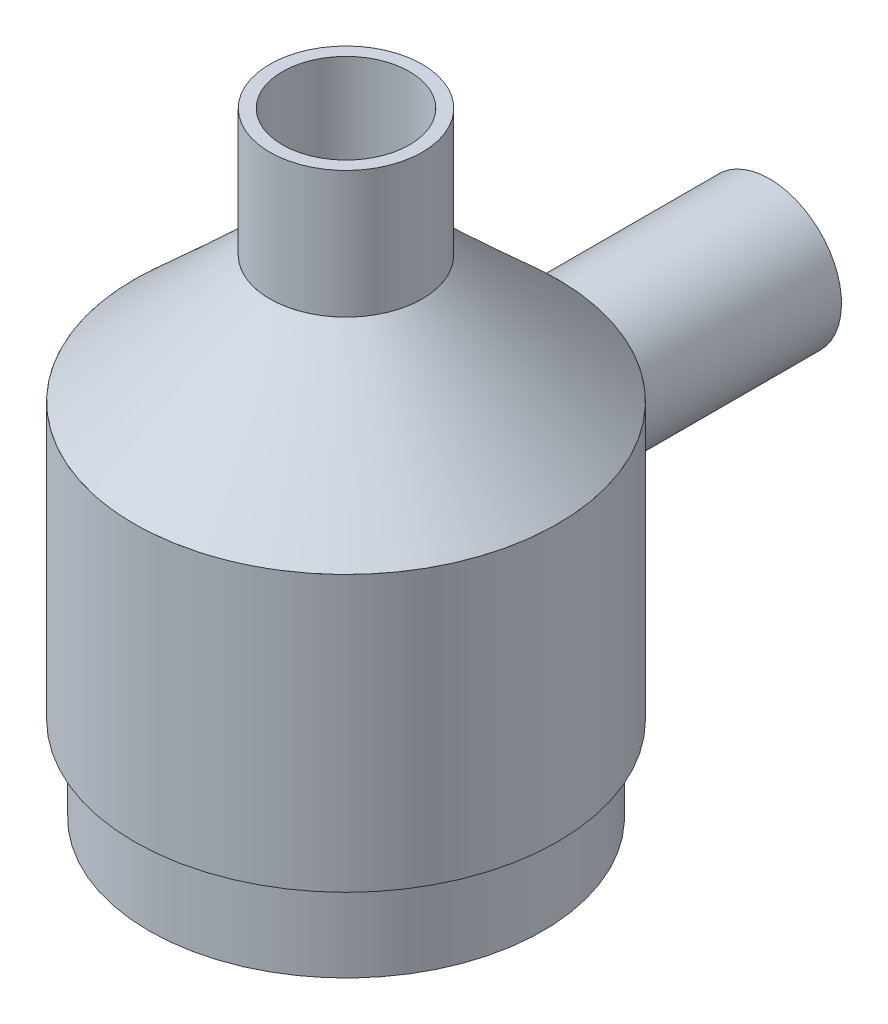
ISO-10303-21;
HEADER;
FILE_DESCRIPTION(('STEP AP214'),'2;1');
FILE_NAME('part.step','',(''),(''),'','','');
FILE_SCHEMA(('AUTOMOTIVE_DESIGN { 1 0 10303 214 1 1 1 1 }'));
ENDSEC;
DATA;
#1=APPLICATION_CONTEXT('core data for automotive mechanical design processes');
#2=APPLICATION_PROTOCOL_DEFINITION('international standard','automotive_design',2000,#1);
#3=PRODUCT_CONTEXT('',#1,'mechanical');
#4=PRODUCT('Part','Part','',(#3));
#5=PRODUCT_RELATED_PRODUCT_CATEGORY('part','',(#4));
#6=PRODUCT_DEFINITION_FORMATION('','',#4);
#7=PRODUCT_DEFINITION_CONTEXT('part definition',#1,'design');
#8=PRODUCT_DEFINITION('design','',#6,#7);
#9=PRODUCT_DEFINITION_SHAPE('','',#8);
#10=(LENGTH_UNIT() NAMED_UNIT(*) SI_UNIT(.MILLI.,.METRE.));
#11=(NAMED_UNIT(*) PLANE_ANGLE_UNIT() SI_UNIT($,.RADIAN.));
#12=(NAMED_UNIT(*) SI_UNIT($,.STERADIAN.) SOLID_ANGLE_UNIT());
#13=UNCERTAINTY_MEASURE_WITH_UNIT(LENGTH_MEASURE(1.E-05),#10,'distance_accuracy_value','');
#14=(GEOMETRIC_REPRESENTATION_CONTEXT(3) GLOBAL_UNCERTAINTY_ASSIGNED_CONTEXT((#13)) GLOBAL_UNIT_ASSIGNED_CONTEXT((#10,
#11,#12)) REPRESENTATION_CONTEXT('',''));
#15=CARTESIAN_POINT('',(0.,0.,0.));
#16=DIRECTION('',(0.,0.,1.));
#17=DIRECTION('',(1.,0.,0.));
#18=AXIS2_PLACEMENT_3D('',#15,#16,#17);
#19=CARTESIAN_POINT('',(-4.25179771522221,32.5,-24.6357913651831));
#20=CARTESIAN_POINT('',(-4.27121897762393,47.5,-7.92191191854499));
#21=CARTESIAN_POINT('',(-53.5233804455884,32.5,-16.1321959347387));
#22=CARTESIAN_POINT('',(-20.1150428147139,47.5,0.620526036702854));
#23=CARTESIAN_POINT('',(-45.019785015144,32.5,33.1393867956275));
#24=CARTESIAN_POINT('',(-11.5726048594661,47.5,16.4643498737928));
#25=CARTESIAN_POINT('',(4.2517977152222,32.5,24.6357913651831));
#26=CARTESIAN_POINT('',(4.27121897762392,47.5,7.92191191854499));
#27=CARTESIAN_POINT('',(53.5233804455884,32.5,16.1321959347387));
#28=CARTESIAN_POINT('',(20.1150428147139,47.5,-0.620526036702852));
#29=CARTESIAN_POINT('',(45.0197850151441,32.5,-33.1393867956275));
#30=CARTESIAN_POINT('',(11.5726048594661,47.5,-16.4643498737928));
#31=CARTESIAN_POINT('',(-4.25179771522221,32.5,-24.6357913651831));
#32=CARTESIAN_POINT('',(-4.27121897762393,47.5,-7.92191191854499));
#33=(BOUNDED_SURFACE() B_SPLINE_SURFACE(3,1,((#19,#20),(#21,#22),(#23,#24),(#25,#26),(#27,#28),
(#29,#30),(#31,#32)),.UNSPECIFIED.,.T.,.F.,.F.) B_SPLINE_SURFACE_WITH_KNOTS((4,3,4),(2,2),(0.,
0.5,1.),(0.,1.),.UNSPECIFIED.) GEOMETRIC_REPRESENTATION_ITEM() RATIONAL_B_SPLINE_SURFACE(((1.,
1.),(0.333333333333334,0.333333333333333),(0.333333333333334,0.333333333333333),(1.,1.),
(0.333333333333333,0.333333333333333),(0.333333333333333,0.333333333333333),(1.,1.))) REPRESENTATION_ITEM('') SURFACE());
#34=CARTESIAN_POINT('',(0.,32.5,0.));
#35=DIRECTION('',(0.,1.,0.));
#36=DIRECTION('',(-0.170071908608888,0.,-0.985431654607325));
#37=AXIS2_PLACEMENT_3D('',#34,#35,#36);
#38=CIRCLE('',#37,25.);
#39=CARTESIAN_POINT('',(-4.25179771522221,32.5,-24.6357913651831));
#40=VERTEX_POINT('',#39);
#41=EDGE_CURVE('E14',#40,#40,#38,.T.);
#42=CARTESIAN_POINT('',(0.,47.5,0.));
#43=DIRECTION('',(0.,-1.,0.));
#44=DIRECTION('',(-0.474579886402658,0.,-0.880212435393888));
#45=AXIS2_PLACEMENT_3D('',#42,#43,#44);
#46=CIRCLE('',#45,9.);
#47=CARTESIAN_POINT('',(-4.27121897762393,47.5,-7.92191191854499));
#48=VERTEX_POINT('',#47);
#49=EDGE_CURVE('E82',#48,#48,#46,.T.);
#50=CARTESIAN_POINT('',(-4.25179771522221,32.5,-24.6357913651831));
#51=CARTESIAN_POINT('',(-4.2520000200389,32.65625,-24.4616884542806));
#52=CARTESIAN_POINT('',(-4.25220232485558,32.8125,-24.2875855433782));
#53=CARTESIAN_POINT('',(-4.25260693448895,33.125,-23.9393797215732));
#54=CARTESIAN_POINT('',(-4.25280923930563,33.28125,-23.7652768106707));
#55=CARTESIAN_POINT('',(-4.253213848939,33.59375,-23.4170709888658));
#56=CARTESIAN_POINT('',(-4.25341615375569,33.75,-23.2429680779633));
#57=CARTESIAN_POINT('',(-4.25382076338906,34.0625,-22.8947622561583));
#58=CARTESIAN_POINT('',(-4.25402306820574,34.21875,-22.7206593452558));
#59=CARTESIAN_POINT('',(-4.25442767783911,34.53125,-22.3724535234509));
#60=CARTESIAN_POINT('',(-4.2546299826558,34.6875,-22.1983506125484));
#61=CARTESIAN_POINT('',(-4.25503459228916,35.,-21.8501447907434));
#62=CARTESIAN_POINT('',(-4.25523689710585,35.15625,-21.676041879841));
#63=CARTESIAN_POINT('',(-4.25564150673922,35.46875,-21.327836058036));
#64=CARTESIAN_POINT('',(-4.2558438115559,35.625,-21.1537331471335));
#65=CARTESIAN_POINT('',(-4.25624842118927,35.9375,-20.8055273253286));
#66=CARTESIAN_POINT('',(-4.25645072600596,36.09375,-20.6314244144261));
#67=CARTESIAN_POINT('',(-4.25685533563933,36.40625,-20.2832185926211));
#68=CARTESIAN_POINT('',(-4.25705764045601,36.5625,-20.1091156817186));
#69=CARTESIAN_POINT('',(-4.25746225008938,36.875,-19.7609098599137));
#70=CARTESIAN_POINT('',(-4.25766455490606,37.03125,-19.5868069490112));
#71=CARTESIAN_POINT('',(-4.25806916453943,37.34375,-19.2386011272062));
#72=CARTESIAN_POINT('',(-4.25827146935612,37.5,-19.0644982163037));
#73=CARTESIAN_POINT('',(-4.25867607898949,37.8125,-18.7162923944988));
#74=CARTESIAN_POINT('',(-4.25887838380617,37.96875,-18.5421894835963));
#75=CARTESIAN_POINT('',(-4.25928299343954,38.28125,-18.1939836617913));
#76=CARTESIAN_POINT('',(-4.25948529825622,38.4375,-18.0198807508889));
#77=CARTESIAN_POINT('',(-4.25988990788959,38.75,-17.6716749290839));
#78=CARTESIAN_POINT('',(-4.26009221270628,38.90625,-17.4975720181814));
#79=CARTESIAN_POINT('',(-4.26049682233965,39.21875,-17.1493661963765));
#80=CARTESIAN_POINT('',(-4.26069912715633,39.375,-16.975263285474));
#81=CARTESIAN_POINT('',(-4.2611037367897,39.6875,-16.627057463669));
#82=CARTESIAN_POINT('',(-4.26130604160638,39.84375,-16.4529545527665));
#83=CARTESIAN_POINT('',(-4.26171065123975,40.15625,-16.1047487309616));
#84=CARTESIAN_POINT('',(-4.26191295605644,40.3125,-15.9306458200591));
#85=CARTESIAN_POINT('',(-4.26231756568981,40.625,-15.5824399982541));
#86=CARTESIAN_POINT('',(-4.26251987050649,40.78125,-15.4083370873517));
#87=CARTESIAN_POINT('',(-4.26292448013986,41.09375,-15.0601312655467));
#88=CARTESIAN_POINT('',(-4.26312678495654,41.25,-14.8860283546442));
#89=CARTESIAN_POINT('',(-4.26353139458991,41.5625,-14.5378225328393));
#90=CARTESIAN_POINT('',(-4.2637336994066,41.71875,-14.3637196219368));
#91=CARTESIAN_POINT('',(-4.26413830903997,42.03125,-14.0155138001318));
#92=CARTESIAN_POINT('',(-4.26434061385665,42.1875,-13.8414108892293));
#93=CARTESIAN_POINT('',(-4.26474522349002,42.5,-13.4932050674244));
#94=CARTESIAN_POINT('',(-4.26494752830671,42.65625,-13.3191021565219));
#95=CARTESIAN_POINT('',(-4.26535213794007,42.96875,-12.9708963347169));
#96=CARTESIAN_POINT('',(-4.26555444275676,43.125,-12.7967934238144));
#97=CARTESIAN_POINT('',(-4.26595905239013,43.4375,-12.4485876020095));
#98=CARTESIAN_POINT('',(-4.26616135720681,43.59375,-12.274484691107));
#99=CARTESIAN_POINT('',(-4.26656596684018,43.90625,-11.926278869302));
#100=CARTESIAN_POINT('',(-4.26676827165687,44.0625,-11.7521759583996));
#101=CARTESIAN_POINT('',(-4.26717288129023,44.375,-11.4039701365946));
#102=CARTESIAN_POINT('',(-4.26737518610692,44.53125,-11.2298672256921));
#103=CARTESIAN_POINT('',(-4.26777979574029,44.84375,-10.8816614038872));
#104=CARTESIAN_POINT('',(-4.26798210055697,45.,-10.7075584929847));
#105=CARTESIAN_POINT('',(-4.26838671019034,45.3125,-10.3593526711797));
#106=CARTESIAN_POINT('',(-4.26858901500703,45.46875,-10.1852497602772));
#107=CARTESIAN_POINT('',(-4.26899362464039,45.78125,-9.83704393847228));
#108=CARTESIAN_POINT('',(-4.26919592945708,45.9375,-9.6629410275698));
#109=CARTESIAN_POINT('',(-4.26960053909045,46.25,-9.31473520576484));
#110=CARTESIAN_POINT('',(-4.26980284390713,46.40625,-9.14063229486236));
#111=CARTESIAN_POINT('',(-4.2702074535405,46.71875,-8.7924264730574));
#112=CARTESIAN_POINT('',(-4.27040975835719,46.875,-8.61832356215492));
#113=CARTESIAN_POINT('',(-4.27081436799056,47.1875,-8.27011774034995));
#114=CARTESIAN_POINT('',(-4.27101667280724,47.34375,-8.09601482944747));
#115=CARTESIAN_POINT('',(-4.27121897762393,47.5,-7.92191191854499));
#116=B_SPLINE_CURVE_WITH_KNOTS('',3,(#50,#51,#52,#53,#54,#55,#56,#57,#58,#59,#60,#61,#62,#63,
#64,#65,#66,#67,#68,#69,#70,#71,#72,#73,#74,#75,#76,#77,#78,#79,#80,#81,#82,#83,#84,#85,#86,#87,
#88,#89,#90,#91,#92,#93,#94,#95,#96,#97,#98,#99,#100,#101,#102,#103,#104,#105,#106,#107,#108,
#109,#110,#111,#112,#113,#114,#115),.UNSPECIFIED.,.F.,.F.,(4,2,2,2,2,2,2,2,2,2,2,2,2,2,2,2,2,2,
2,2,2,2,2,2,2,2,2,2,2,2,2,2,4),(0.,0.701807197959388,1.40361439591877,2.10542159387815,
2.80722879183754,3.50903598979692,4.21084318775631,4.91265038571569,5.61445758367508,
6.31626478163447,7.01807197959385,7.71987917755323,8.42168637551262,9.12349357347201,
9.82530077143139,10.5271079693908,11.2289151673502,11.9307223653095,12.6325295632689,
13.3343367612283,14.0361439591877,14.7379511571471,15.4397583551065,16.1415655530659,
16.8433727510252,17.5451799489846,18.246987146944,18.9487943449034,19.6506015428628,
20.3524087408222,21.0542159387815,21.7560231367409,22.4578303347003),.UNSPECIFIED.);
#117=EDGE_CURVE('BSEAM79',#40,#48,#116,.T.);
#118=ORIENTED_EDGE('',*,*,#41,.T.);
#119=ORIENTED_EDGE('',*,*,#49,.T.);
#120=ORIENTED_EDGE('',*,*,#117,.T.);
#121=ORIENTED_EDGE('',*,*,#117,.F.);
#122=EDGE_LOOP('',(#118,#120,#119,#121));
#123=FACE_BOUND('',#122,.T.);
#124=ADVANCED_FACE('F79',(#123),#33,.T.);
#125=OPEN_SHELL('',(#124));
#126=SHELL_BASED_SURFACE_MODEL('B2',(#125));
#127=CARTESIAN_POINT('',(0.,62.5,0.));
#128=DIRECTION('',(0.,1.,0.));
#129=DIRECTION('',(0.,0.,1.));
#130=AXIS2_PLACEMENT_3D('',#127,#128,#129);
#131=PLANE('',#130);
#132=CARTESIAN_POINT('',(0.,62.5,0.));
#133=DIRECTION('',(0.,1.,0.));
#134=DIRECTION('',(1.,0.,0.));
#135=AXIS2_PLACEMENT_3D('',#132,#133,#134);
#136=CIRCLE('',#135,9.);
#137=CARTESIAN_POINT('',(9.,62.5,0.));
#138=VERTEX_POINT('',#137);
#139=EDGE_CURVE('E78',#138,#138,#136,.T.);
#140=ORIENTED_EDGE('',*,*,#139,.T.);
#141=EDGE_LOOP('',(#140));
#142=FACE_BOUND('',#141,.T.);
#143=CARTESIAN_POINT('',(0.,62.5,0.));
#144=DIRECTION('',(0.,1.,0.));
#145=DIRECTION('',(0.,0.,1.));
#146=AXIS2_PLACEMENT_3D('',#143,#144,#145);
#147=CIRCLE('',#146,7.5);
#148=CARTESIAN_POINT('',(0.,62.5,7.5));
#149=VERTEX_POINT('',#148);
#150=EDGE_CURVE('E137',#149,#149,#147,.T.);
#151=ORIENTED_EDGE('',*,*,#150,.F.);
#152=EDGE_LOOP('',(#151));
#153=FACE_BOUND('',#152,.T.);
#154=ADVANCED_FACE('F126',(#142,#153),#131,.T.);
#155=CARTESIAN_POINT('',(0.,47.5,0.));
#156=DIRECTION('',(0.,1.,0.));
#157=DIRECTION('',(0.,0.,1.));
#158=AXIS2_PLACEMENT_3D('',#155,#156,#157);
#159=PLANE('',#158);
#160=CARTESIAN_POINT('',(0.,47.5,0.));
#161=DIRECTION('',(0.,1.,0.));
#162=DIRECTION('',(1.,0.,0.));
#163=AXIS2_PLACEMENT_3D('',#160,#161,#162);
#164=CIRCLE('',#163,9.);
#165=CARTESIAN_POINT('',(9.,47.5,0.));
#166=VERTEX_POINT('',#165);
#167=EDGE_CURVE('E130',#166,#166,#164,.T.);
#168=ORIENTED_EDGE('',*,*,#167,.F.);
#169=EDGE_LOOP('',(#168));
#170=FACE_BOUND('',#169,.T.);
#171=CARTESIAN_POINT('',(0.,47.5,0.));
#172=DIRECTION('',(0.,1.,0.));
#173=DIRECTION('',(0.,0.,1.));
#174=AXIS2_PLACEMENT_3D('',#171,#172,#173);
#175=CIRCLE('',#174,7.5);
#176=CARTESIAN_POINT('',(0.,47.5,7.5));
#177=VERTEX_POINT('',#176);
#178=EDGE_CURVE('E139',#177,#177,#175,.T.);
#179=ORIENTED_EDGE('',*,*,#178,.T.);
#180=EDGE_LOOP('',(#179));
#181=FACE_BOUND('',#180,.T.);
#182=ADVANCED_FACE('F149',(#170,#181),#159,.F.);
#183=CARTESIAN_POINT('',(0.,62.5,0.));
#184=DIRECTION('',(0.,-1.,0.));
#185=DIRECTION('',(0.,0.,-1.));
#186=AXIS2_PLACEMENT_3D('',#183,#184,#185);
#187=CYLINDRICAL_SURFACE('',#186,9.);
#188=ORIENTED_EDGE('',*,*,#139,.F.);
#189=EDGE_LOOP('',(#188));
#190=FACE_BOUND('',#189,.T.);
#191=ORIENTED_EDGE('',*,*,#167,.T.);
#192=EDGE_LOOP('',(#191));
#193=FACE_BOUND('',#192,.T.);
#194=ADVANCED_FACE('F128',(#190,#193),#187,.T.);
#195=CARTESIAN_POINT('',(0.,62.5,0.));
#196=DIRECTION('',(0.,-1.,0.));
#197=DIRECTION('',(0.,0.,-1.));
#198=AXIS2_PLACEMENT_3D('',#195,#196,#197);
#199=CYLINDRICAL_SURFACE('',#198,7.5);
#200=ORIENTED_EDGE('',*,*,#150,.T.);
#201=EDGE_LOOP('',(#200));
#202=FACE_BOUND('',#201,.T.);
#203=ORIENTED_EDGE('',*,*,#178,.F.);
#204=EDGE_LOOP('',(#203));
#205=FACE_BOUND('',#204,.T.);
#206=ADVANCED_FACE('F145',(#202,#205),#199,.F.);
#207=CLOSED_SHELL('',(#154,#182,#194,#206));
#208=MANIFOLD_SOLID_BREP('B9',#207);
#209=CARTESIAN_POINT('',(0.,32.5,0.));
#210=DIRECTION('',(0.,-1.,0.));
#211=DIRECTION('',(0.,0.,-1.));
#212=AXIS2_PLACEMENT_3D('',#209,#210,#211);
#213=CYLINDRICAL_SURFACE('',#212,25.);
#214=CARTESIAN_POINT('',(0.,0.,0.));
#215=DIRECTION('',(0.,1.,0.));
#216=DIRECTION('',(0.,0.,1.));
#217=AXIS2_PLACEMENT_3D('',#214,#215,#216);
#218=CIRCLE('',#217,25.);
#219=CARTESIAN_POINT('',(0.,0.,25.));
#220=VERTEX_POINT('',#219);
#221=EDGE_CURVE('E214',#220,#220,#218,.T.);
#222=ORIENTED_EDGE('',*,*,#221,.T.);
#223=EDGE_LOOP('',(#222));
#224=FACE_BOUND('',#223,.T.);
#225=CARTESIAN_POINT('',(0.,32.5,0.));
#226=DIRECTION('',(0.,1.,0.));
#227=DIRECTION('',(0.,0.,1.));
#228=AXIS2_PLACEMENT_3D('',#225,#226,#227);
#229=CIRCLE('',#228,25.);
#230=CARTESIAN_POINT('',(0.,32.5,25.));
#231=VERTEX_POINT('',#230);
#232=EDGE_CURVE('E209',#231,#231,#229,.T.);
#233=ORIENTED_EDGE('',*,*,#232,.F.);
#234=EDGE_LOOP('',(#233));
#235=FACE_BOUND('',#234,.T.);
#236=CARTESIAN_POINT('',(0.,30.2868913995965,-25.));
#237=CARTESIAN_POINT('',(0.23162803769717,30.2868916255567,-25.0000001543121));
#238=CARTESIAN_POINT('',(0.463252678184794,30.2774159453594,-24.9967736038645));
#239=CARTESIAN_POINT('',(0.924775190741755,30.2396067634595,-24.9839564691861));
#240=CARTESIAN_POINT('',(1.15467309670753,30.2112736329191,-24.9743660102131));
#241=CARTESIAN_POINT('',(1.61107065061898,30.136019875905,-24.9490820031585));
#242=CARTESIAN_POINT('',(1.83757015788683,30.0890984821551,-24.933388203147));
#243=CARTESIAN_POINT('',(2.28555690162751,29.9771014610211,-24.8963200365297));
#244=CARTESIAN_POINT('',(2.50704408899115,29.9120256558487,-24.874945614293));
#245=CARTESIAN_POINT('',(2.94307379111683,29.7644344140091,-24.8271289425137));
#246=CARTESIAN_POINT('',(3.1576289680736,29.6819531223719,-24.8006966245724));
#247=CARTESIAN_POINT('',(3.57894179103804,29.500116399475,-24.7434111423367));
#248=CARTESIAN_POINT('',(3.78569651614004,29.4007547224528,-24.7125563423815));
#249=CARTESIAN_POINT('',(4.19005024041807,29.1859379771247,-24.6472194238869));
#250=CARTESIAN_POINT('',(4.38764967897082,29.0704836821971,-24.6127374796801));
#251=CARTESIAN_POINT('',(4.77255961075017,28.8242825248885,-24.5410066887078));
#252=CARTESIAN_POINT('',(4.95986946988953,28.6935347216071,-24.5037576717556));
#253=CARTESIAN_POINT('',(5.32900414369409,28.4131388997004,-24.4261832221144));
#254=CARTESIAN_POINT('',(5.5104561614958,28.263016686345,-24.3857972746735));
#255=CARTESIAN_POINT('',(5.86017860901211,27.9483554761651,-24.3041263740309));
#256=CARTESIAN_POINT('',(6.02844881198951,27.7838162314599,-24.2628414053809));
#257=CARTESIAN_POINT('',(6.35083545386179,27.4412892852797,-24.180458658402));
#258=CARTESIAN_POINT('',(6.50494849340074,27.2632983724525,-24.1393609272714));
#259=CARTESIAN_POINT('',(6.79800908657559,26.8949692807778,-24.0584742899795));
#260=CARTESIAN_POINT('',(6.93695702506235,26.7046314154593,-24.0186853506224));
#261=CARTESIAN_POINT('',(7.20276027936205,26.3067594349629,-23.9403431241854));
#262=CARTESIAN_POINT('',(7.32911873026012,26.0988782270905,-23.9018643216007));
#263=CARTESIAN_POINT('',(7.56374725039068,25.6726202839987,-23.8286557141655));
#264=CARTESIAN_POINT('',(7.67202447540048,25.4542477450701,-23.7939244281427));
#265=CARTESIAN_POINT('',(7.86964307432386,25.008407949901,-23.7292969459729));
#266=CARTESIAN_POINT('',(7.95898517951526,24.78094104529,-23.6994005631117));
#267=CARTESIAN_POINT('',(8.11791450940276,24.3185359540213,-23.6454333303003));
#268=CARTESIAN_POINT('',(8.18750266346198,24.0835981194266,-23.6213622062974));
#269=CARTESIAN_POINT('',(8.30416277712833,23.6163261992918,-23.580597240864));
#270=CARTESIAN_POINT('',(8.35193501349259,23.3841867912787,-23.5636755025818));
#271=CARTESIAN_POINT('',(8.42795955438066,22.9163410072327,-23.5365913575349));
#272=CARTESIAN_POINT('',(8.45621227922022,22.6806347081178,-23.5264288052241));
#273=CARTESIAN_POINT('',(8.49289811417183,22.2075517111718,-23.5132104033373));
#274=CARTESIAN_POINT('',(8.50133677159984,21.9701754995353,-23.5101525646673));
#275=CARTESIAN_POINT('',(8.49831992824177,21.4955698627132,-23.5112433322576));
#276=CARTESIAN_POINT('',(8.48686501880571,21.2583404333741,-23.5153917243078));
#277=CARTESIAN_POINT('',(8.44521300109302,20.7972648245707,-23.5303810530578));
#278=CARTESIAN_POINT('',(8.4159430143602,20.5733233488841,-23.540890795228));
#279=CARTESIAN_POINT('',(8.33975230432048,20.1287570992469,-23.5679902613032));
#280=CARTESIAN_POINT('',(8.29282535822221,19.9081335231552,-23.5845821286608));
#281=CARTESIAN_POINT('',(8.18175945848226,19.4718377495788,-23.6233415189748));
#282=CARTESIAN_POINT('',(8.11762541813786,19.2561641577337,-23.6455074502052));
#283=CARTESIAN_POINT('',(7.97265261240356,18.8310028439603,-23.6947814473427));
#284=CARTESIAN_POINT('',(7.89180749581348,18.6215175086345,-23.7218913918054));
#285=CARTESIAN_POINT('',(7.71261755582236,18.2067533012113,-23.7807603334195));
#286=CARTESIAN_POINT('',(7.61401067008627,18.0015973916794,-23.812587475774));
#287=CARTESIAN_POINT('',(7.40090560047334,17.6002164288753,-23.8796790817131));
#288=CARTESIAN_POINT('',(7.28640199131278,17.4039944550945,-23.9149447175692));
#289=CARTESIAN_POINT('',(7.04229507538307,17.0216497153125,-23.9879616701294));
#290=CARTESIAN_POINT('',(6.91269062446661,16.8355277161253,-24.0257131750864));
#291=CARTESIAN_POINT('',(6.63919824838827,16.4744201283293,-24.1027223696246));
#292=CARTESIAN_POINT('',(6.49530979680069,16.2994349505497,-24.1419801146843));
#293=CARTESIAN_POINT('',(6.18585071595458,15.9523197249253,-24.2231751078499));
#294=CARTESIAN_POINT('',(6.01952466250803,15.780869188167,-24.2651414793859));
#295=CARTESIAN_POINT('',(5.67301811146199,15.4525552903299,-24.3484825728025));
#296=CARTESIAN_POINT('',(5.49284197226053,15.2956873743882,-24.3898574759873));
#297=CARTESIAN_POINT('',(5.11959794055616,14.9974283064665,-24.470925562161));
#298=CARTESIAN_POINT('',(4.92652385395321,14.8560446779306,-24.5106179219519));
#299=CARTESIAN_POINT('',(4.52883309150116,14.5898853104488,-24.5872050954354));
#300=CARTESIAN_POINT('',(4.324221034221,14.4651029923715,-24.6241010148531));
#301=CARTESIAN_POINT('',(3.90233832658123,14.2317268877797,-24.6944931105312));
#302=CARTESIAN_POINT('',(3.6849518560068,14.1233293857438,-24.727946732765));
#303=CARTESIAN_POINT('',(3.24120406330873,13.9253651948916,-24.7900132837587));
#304=CARTESIAN_POINT('',(3.01484650116272,13.8357907141021,-24.8186282145802));
#305=CARTESIAN_POINT('',(2.55471500957056,13.6762367456182,-24.8702033741715));
#306=CARTESIAN_POINT('',(2.32094167240808,13.6062556973988,-24.8931640532583));
#307=CARTESIAN_POINT('',(1.84773858974423,13.4865652101846,-24.9327539500603));
#308=CARTESIAN_POINT('',(1.60830911683954,13.4368547963494,-24.9493834722463));
#309=CARTESIAN_POINT('',(1.1365339558798,13.3599808252757,-24.9752192147616));
#310=CARTESIAN_POINT('',(0.904352991020386,13.3319050143302,-24.9847252542778));
#311=CARTESIAN_POINT('',(0.43829472261291,13.2949813988762,-24.9972444659878));
#312=CARTESIAN_POINT('',(0.204417470111823,13.2861330181391,-25.0002578327611));
#313=CARTESIAN_POINT('',(-0.263224217946379,13.2877514940885,-24.9997075848963));
#314=CARTESIAN_POINT('',(-0.496988665457732,13.2982153151534,-24.9961450039099));
#315=CARTESIAN_POINT('',(-0.962670404074465,13.3383482494436,-24.9825444086867));
#316=CARTESIAN_POINT('',(-1.19458771511985,13.368017155063,-24.9725064644483));
#317=CARTESIAN_POINT('',(-1.64779533504523,13.4450702730512,-24.9466372348493));
#318=CARTESIAN_POINT('',(-1.86919361985631,13.4918843304205,-24.9309927186328));
#319=CARTESIAN_POINT('',(-2.30721047547598,13.6028921625936,-24.8942784681886));
#320=CARTESIAN_POINT('',(-2.52382731966279,13.6670921080491,-24.873206807873));
#321=CARTESIAN_POINT('',(-2.95072957269216,13.8123057436777,-24.8261817885394));
#322=CARTESIAN_POINT('',(-3.16101673501465,13.8933147273159,-24.8002297962058));
#323=CARTESIAN_POINT('',(-3.57409989260811,14.0715538232197,-24.7440756689455));
#324=CARTESIAN_POINT('',(-3.77689301771443,14.1687900733604,-24.7138719264965));
#325=CARTESIAN_POINT('',(-4.17897479505745,14.3815376395139,-24.6491121386596));
#326=CARTESIAN_POINT('',(-4.37802812790436,14.4974649968746,-24.6144619602187));
#327=CARTESIAN_POINT('',(-4.76578270776736,14.7448585810743,-24.5423353664262));
#328=CARTESIAN_POINT('',(-4.95448035411386,14.8763301631417,-24.5048579786756));
#329=CARTESIAN_POINT('',(-5.32039022908781,15.1539289254318,-24.4280249785621));
#330=CARTESIAN_POINT('',(-5.49760124711685,15.3000576462782,-24.3886691689851));
#331=CARTESIAN_POINT('',(-5.83951748295537,15.6060600602287,-24.3090693709437));
#332=CARTESIAN_POINT('',(-6.00422235404594,15.7659341341455,-24.2688253578948));
#333=CARTESIAN_POINT('',(-6.32771173398326,16.1064162504955,-24.1865506304934));
#334=CARTESIAN_POINT('',(-6.48584098241774,16.287649062303,-24.144526077943));
#335=CARTESIAN_POINT('',(-6.78626013695343,16.6629829856959,-24.0618151219228));
#336=CARTESIAN_POINT('',(-6.92855525756888,16.857079827084,-24.0211282810447));
#337=CARTESIAN_POINT('',(-7.1964443400882,17.2570842496477,-23.9422367633352));
#338=CARTESIAN_POINT('',(-7.32203110792075,17.4629968640449,-23.9040331593019));
#339=CARTESIAN_POINT('',(-7.55544078890037,17.8851655955241,-23.8312874111166));
#340=CARTESIAN_POINT('',(-7.66327111792708,18.1014173455818,-23.7967437405738));
#341=CARTESIAN_POINT('',(-7.86026880332722,18.5427400412642,-23.7324021417822));
#342=CARTESIAN_POINT('',(-7.94945092158531,18.7678038424341,-23.7026004642834));
#343=CARTESIAN_POINT('',(-8.10842421386605,19.225240103445,-23.6486893401284));
#344=CARTESIAN_POINT('',(-8.17822374708985,19.4576093643484,-23.6245774402962));
#345=CARTESIAN_POINT('',(-8.29778999202296,19.9279791615143,-23.5828475187725));
#346=CARTESIAN_POINT('',(-8.34756030665934,20.1659786768238,-23.5652283291973));
#347=CARTESIAN_POINT('',(-8.42656233637607,20.6457741519838,-23.53709443267));
#348=CARTESIAN_POINT('',(-8.45579514366149,20.8875699092471,-23.5265793479157));
#349=CARTESIAN_POINT('',(-8.49240069258209,21.3600053969552,-23.513389400672));
#350=CARTESIAN_POINT('',(-8.50085803140773,21.5905508716202,-23.5103256293001));
#351=CARTESIAN_POINT('',(-8.4990046869291,22.0515514566075,-23.5109957851473));
#352=CARTESIAN_POINT('',(-8.48869470403645,22.282006569981,-23.5147294586802));
#353=CARTESIAN_POINT('',(-8.44941252338774,22.7410945352189,-23.528872907133));
#354=CARTESIAN_POINT('',(-8.42044156204107,22.9697275067959,-23.5392822397474));
#355=CARTESIAN_POINT('',(-8.34412285595471,23.4235197583699,-23.5664433133013));
#356=CARTESIAN_POINT('',(-8.29677506065829,23.6486790288087,-23.5831950716895));
#357=CARTESIAN_POINT('',(-8.18532119819537,24.08929944022,-23.6221065882914));
#358=CARTESIAN_POINT('',(-8.12158465538569,24.3048648975174,-23.6441464601509));
#359=CARTESIAN_POINT('',(-7.97742997390032,24.7298452930155,-23.6931720947785));
#360=CARTESIAN_POINT('',(-7.89700592613631,24.9392580224514,-23.7201596091242));
#361=CARTESIAN_POINT('',(-7.72011962191144,25.350579393687,-23.7783181531904));
#362=CARTESIAN_POINT('',(-7.62365786497037,25.5524882689665,-23.809489052607));
#363=CARTESIAN_POINT('',(-7.4153795820286,25.94766524251,-23.8751767496494));
#364=CARTESIAN_POINT('',(-7.30356198310939,26.1409327357455,-23.9096937810212));
#365=CARTESIAN_POINT('',(-7.05993740207058,26.5262535052309,-23.9827890982967));
#366=CARTESIAN_POINT('',(-6.92745670696071,26.7178596085278,-24.0214803033409));
#367=CARTESIAN_POINT('',(-6.64740684003873,27.0893527077216,-24.100480168788));
#368=CARTESIAN_POINT('',(-6.49983728042502,27.2692394022213,-24.1407888707463));
#369=CARTESIAN_POINT('',(-6.19048170713838,27.6162985214957,-24.2219633668258));
#370=CARTESIAN_POINT('',(-6.02869181296746,27.7834674524377,-24.2628293104228));
#371=CARTESIAN_POINT('',(-5.69189317449502,28.1040429526284,-24.3440414750372));
#372=CARTESIAN_POINT('',(-5.5168845814345,28.2574496792927,-24.3843877019948));
#373=CARTESIAN_POINT('',(-5.14714530461234,28.5556140369452,-24.4651621911892));
#374=CARTESIAN_POINT('',(-4.95189781237325,28.699749551326,-24.5055245282518));
#375=CARTESIAN_POINT('',(-4.54947103526151,28.9709829189396,-24.5834150613553));
#376=CARTESIAN_POINT('',(-4.34229594052523,29.0980867037908,-24.6209442420974));
#377=CARTESIAN_POINT('',(-3.91729433433973,29.3343356190951,-24.6921287561997));
#378=CARTESIAN_POINT('',(-3.69946744297828,29.4434801083961,-24.7257839512446));
#379=CARTESIAN_POINT('',(-3.25466498506137,29.6428795938729,-24.7882548880035));
#380=CARTESIAN_POINT('',(-3.02768980229534,29.7331353814865,-24.8170708324725));
#381=CARTESIAN_POINT('',(-2.57345729661192,29.8914171705365,-24.8682107307813));
#382=CARTESIAN_POINT('',(-2.34643142342836,29.9600508314456,-24.8907097351947));
#383=CARTESIAN_POINT('',(-1.88696200355656,30.0781900545856,-24.9297517248808));
#384=CARTESIAN_POINT('',(-1.65451881097435,30.1276968633562,-24.9462950982906));
#385=CARTESIAN_POINT('',(-1.18599504332344,30.2070966765168,-24.9729545061932));
#386=CARTESIAN_POINT('',(-0.949915327928071,30.2369942458512,-24.9830720365765));
#387=CARTESIAN_POINT('',(-0.475889190884068,30.2768913120109,-24.9965946437284));
#388=CARTESIAN_POINT('',(-0.237942802958269,30.2868911674761,-24.999999841481));
#389=CARTESIAN_POINT('',(0.,30.2868913995965,-25.));
#390=B_SPLINE_CURVE_WITH_KNOTS('',3,(#236,#237,#238,#239,#240,#241,#242,#243,#244,#245,#246,
#247,#248,#249,#250,#251,#252,#253,#254,#255,#256,#257,#258,#259,#260,#261,#262,#263,#264,#265,
#266,#267,#268,#269,#270,#271,#272,#273,#274,#275,#276,#277,#278,#279,#280,#281,#282,#283,#284,
#285,#286,#287,#288,#289,#290,#291,#292,#293,#294,#295,#296,#297,#298,#299,#300,#301,#302,#303,
#304,#305,#306,#307,#308,#309,#310,#311,#312,#313,#314,#315,#316,#317,#318,#319,#320,#321,#322,
#323,#324,#325,#326,#327,#328,#329,#330,#331,#332,#333,#334,#335,#336,#337,#338,#339,#340,#341,
#342,#343,#344,#345,#346,#347,#348,#349,#350,#351,#352,#353,#354,#355,#356,#357,#358,#359,#360,
#361,#362,#363,#364,#365,#366,#367,#368,#369,#370,#371,#372,#373,#374,#375,#376,#377,#378,#379,
#380,#381,#382,#383,#384,#385,#386,#387,#388,#389),.UNSPECIFIED.,.T.,.F.,(4,2,2,2,2,2,2,2,2,2,2,
2,2,2,2,2,2,2,2,2,2,2,2,2,2,2,2,2,2,2,2,2,2,2,2,2,2,2,2,2,2,2,2,2,2,2,2,2,2,2,2,2,2,2,2,2,2,2,2,
2,2,2,2,2,2,2,2,2,2,2,2,2,2,2,2,2,4),(0.,0.694663058338249,1.38931244435689,2.08399050672061,
2.77867537238693,3.47200990982814,4.16560154281216,4.85915985468083,5.55276085870005,
6.26877351310542,6.98479848076656,7.70099493023962,8.41717320027929,9.15515253658628,
9.89283911643095,10.6304972014896,11.3681205762324,12.0800334438911,12.7919309813755,
13.5036291861527,14.2153062355711,14.8927831942505,15.5704991381598,16.2480217732753,
16.925802382198,17.6145532027365,18.3035396628122,18.9925783593969,19.6816424593987,
20.4083909752194,21.1349117239545,21.8617839201402,22.5883671919117,23.3230621726249,
24.0574524174368,24.7917841548643,25.5260805731875,26.2274023499753,26.9287031084953,
27.6298936412416,28.3310765942845,29.0107930873899,29.6907511444112,30.3705190692961,
31.0505446978821,31.7485928847946,32.44688226485,33.1452451197404,33.8436273288945,
34.5752612426102,35.3066534961995,36.038359651234,36.7697594338466,37.5005780315774,
38.2310809551494,38.9614524144573,39.6917850289432,40.3830933728562,41.0743759171117,
41.7656126641806,42.4568513129329,43.1336949344038,43.8107786382103,44.4878412571246,
45.1649512067521,45.8725735231125,46.5802140307745,47.2880482451347,47.9958743620762,
48.7330412997206,49.4699508341987,50.2068866708524,50.9437916236618,51.6576185671983,
52.3713989811904,53.085013171222,53.7986144988327),.UNSPECIFIED.);
#391=CARTESIAN_POINT('',(0.,30.2868913995965,-25.));
#392=VERTEX_POINT('',#391);
#393=EDGE_CURVE('E125',#392,#392,#390,.T.);
#394=ORIENTED_EDGE('',*,*,#393,.F.);
#395=EDGE_LOOP('',(#394));
#396=FACE_BOUND('',#395,.T.);
#397=ADVANCED_FACE('F194',(#224,#235,#396),#213,.T.);
#398=CARTESIAN_POINT('',(0.,32.5,0.));
#399=DIRECTION('',(0.,1.,0.));
#400=DIRECTION('',(0.,0.,1.));
#401=AXIS2_PLACEMENT_3D('',#398,#399,#400);
#402=PLANE('',#401);
#403=CARTESIAN_POINT('',(0.,32.5,0.));
#404=DIRECTION('',(0.,-1.,0.));
#405=DIRECTION('',(0.,0.,-1.));
#406=AXIS2_PLACEMENT_3D('',#403,#404,#405);
#407=CIRCLE('',#406,22.9);
#408=CARTESIAN_POINT('',(0.,32.5,-22.9));
#409=VERTEX_POINT('',#408);
#410=EDGE_CURVE('E223',#409,#409,#407,.T.);
#411=ORIENTED_EDGE('',*,*,#410,.T.);
#412=EDGE_LOOP('',(#411));
#413=FACE_BOUND('',#412,.T.);
#414=ORIENTED_EDGE('',*,*,#232,.T.);
#415=EDGE_LOOP('',(#414));
#416=FACE_BOUND('',#415,.T.);
#417=ADVANCED_FACE('F263',(#413,#416),#402,.T.);
#418=CARTESIAN_POINT('',(0.,0.,0.));
#419=DIRECTION('',(0.,1.,0.));
#420=DIRECTION('',(0.,0.,1.));
#421=AXIS2_PLACEMENT_3D('',#418,#419,#420);
#422=PLANE('',#421);
#423=CARTESIAN_POINT('',(0.,0.,0.));
#424=DIRECTION('',(0.,-1.,0.));
#425=DIRECTION('',(0.,0.,-1.));
#426=AXIS2_PLACEMENT_3D('',#423,#424,#425);
#427=CIRCLE('',#426,23.25);
#428=CARTESIAN_POINT('',(0.,0.,-23.25));
#429=VERTEX_POINT('',#428);
#430=EDGE_CURVE('E205',#429,#429,#427,.T.);
#431=ORIENTED_EDGE('',*,*,#430,.F.);
#432=EDGE_LOOP('',(#431));
#433=FACE_BOUND('',#432,.T.);
#434=ORIENTED_EDGE('',*,*,#221,.F.);
#435=EDGE_LOOP('',(#434));
#436=FACE_BOUND('',#435,.T.);
#437=ADVANCED_FACE('F267',(#433,#436),#422,.F.);
#438=CARTESIAN_POINT('',(0.,-10.,0.));
#439=DIRECTION('',(0.,1.,0.));
#440=DIRECTION('',(0.,0.,1.));
#441=AXIS2_PLACEMENT_3D('',#438,#439,#440);
#442=CYLINDRICAL_SURFACE('',#441,23.25);
#443=CARTESIAN_POINT('',(0.,-10.,0.));
#444=DIRECTION('',(0.,-1.,0.));
#445=DIRECTION('',(0.,0.,-1.));
#446=AXIS2_PLACEMENT_3D('',#443,#444,#445);
#447=CIRCLE('',#446,23.25);
#448=CARTESIAN_POINT('',(0.,-10.,-23.25));
#449=VERTEX_POINT('',#448);
#450=EDGE_CURVE('E217',#449,#449,#447,.T.);
#451=ORIENTED_EDGE('',*,*,#450,.F.);
#452=EDGE_LOOP('',(#451));
#453=FACE_BOUND('',#452,.T.);
#454=ORIENTED_EDGE('',*,*,#430,.T.);
#455=EDGE_LOOP('',(#454));
#456=FACE_BOUND('',#455,.T.);
#457=ADVANCED_FACE('F276',(#453,#456),#442,.T.);
#458=CARTESIAN_POINT('',(0.,-10.,0.));
#459=DIRECTION('',(0.,-1.,0.));
#460=DIRECTION('',(0.,0.,-1.));
#461=AXIS2_PLACEMENT_3D('',#458,#459,#460);
#462=PLANE('',#461);
#463=CARTESIAN_POINT('',(0.,-10.,0.));
#464=DIRECTION('',(0.,-1.,0.));
#465=DIRECTION('',(0.,0.,-1.));
#466=AXIS2_PLACEMENT_3D('',#463,#464,#465);
#467=CIRCLE('',#466,22.9);
#468=CARTESIAN_POINT('',(0.,-10.,-22.9));
#469=VERTEX_POINT('',#468);
#470=EDGE_CURVE('E227',#469,#469,#467,.T.);
#471=ORIENTED_EDGE('',*,*,#470,.F.);
#472=EDGE_LOOP('',(#471));
#473=FACE_BOUND('',#472,.T.);
#474=ORIENTED_EDGE('',*,*,#450,.T.);
#475=EDGE_LOOP('',(#474));
#476=FACE_BOUND('',#475,.T.);
#477=ADVANCED_FACE('F281',(#473,#476),#462,.T.);
#478=CARTESIAN_POINT('',(0.,32.5,0.));
#479=DIRECTION('',(0.,-1.,0.));
#480=DIRECTION('',(0.,0.,-1.));
#481=AXIS2_PLACEMENT_3D('',#478,#479,#480);
#482=CYLINDRICAL_SURFACE('',#481,22.9);
#483=CARTESIAN_POINT('',(-7.5,21.7868913995965,-21.6370053380776));
#484=CARTESIAN_POINT('',(-7.49999997716088,21.5824086288055,-21.6370053548346));
#485=CARTESIAN_POINT('',(-7.49163035941004,21.3779255426293,-21.6399119372388));
#486=CARTESIAN_POINT('',(-7.45823492174735,20.9704887098587,-21.6514443371777));
#487=CARTESIAN_POINT('',(-7.43320905784153,20.7675349673053,-21.6600701698186));
#488=CARTESIAN_POINT('',(-7.36674409556315,20.364652726822,-21.6827653010785));
#489=CARTESIAN_POINT('',(-7.32530555202442,20.1647241268638,-21.6968344156859));
#490=CARTESIAN_POINT('',(-7.22638245217745,19.7692267751212,-21.729981910563));
#491=CARTESIAN_POINT('',(-7.16889164294925,19.5736597544472,-21.7490622427054));
#492=CARTESIAN_POINT('',(-7.03851677879058,19.1887255117948,-21.7916031860353));
#493=CARTESIAN_POINT('',(-6.96566894212579,18.9993448925303,-21.8150534762038));
#494=CARTESIAN_POINT('',(-6.80508915420655,18.6274873024208,-21.8656770745183));
#495=CARTESIAN_POINT('',(-6.71735158628352,18.4450129686336,-21.8928517868349));
#496=CARTESIAN_POINT('',(-6.43280186248467,17.9097655217443,-21.9788175871029));
#497=CARTESIAN_POINT('',(-6.21454268653672,17.5688452975139,-22.0420880061406));
#498=CARTESIAN_POINT('',(-5.71832017211205,16.9160995427266,-22.1760851296067));
#499=CARTESIAN_POINT('',(-5.43856723934904,16.6056713150892,-22.2469930445488));
#500=CARTESIAN_POINT('',(-4.98334793770276,16.1779912532741,-22.3517475738349));
#501=CARTESIAN_POINT('',(-4.82557173251348,16.0416883012465,-22.3864180667008));
#502=CARTESIAN_POINT('',(-4.49905207605251,15.7825672364455,-22.4543155453101));
#503=CARTESIAN_POINT('',(-4.33031276158104,15.6597440837367,-22.4875430677356));
#504=CARTESIAN_POINT('',(-3.97843832604596,15.4254565501302,-22.552491079132));
#505=CARTESIAN_POINT('',(-3.79504552984005,15.3143626131681,-22.584151363655));
#506=CARTESIAN_POINT('',(-3.41906065448934,15.1081209356455,-22.644121563514));
#507=CARTESIAN_POINT('',(-3.22647201438107,15.0129672928754,-22.6724327177858));
#508=CARTESIAN_POINT('',(-2.8333612053665,14.8393570797331,-22.7249066469753));
#509=CARTESIAN_POINT('',(-2.63283907238146,14.7609004337706,-22.7490694406732));
#510=CARTESIAN_POINT('',(-2.225317151905,14.6213948429352,-22.7925414015166));
#511=CARTESIAN_POINT('',(-2.0183176317967,14.5603451805605,-22.8118507687125));
#512=CARTESIAN_POINT('',(-1.6064707055243,14.457993202064,-22.8444846005807));
#513=CARTESIAN_POINT('',(-1.40178547338532,14.4160952469634,-22.8579886732898));
#514=CARTESIAN_POINT('',(-0.989354901555195,14.3494990165693,-22.8795500417331));
#515=CARTESIAN_POINT('',(-0.781609679849164,14.3248000798907,-22.8876075469139));
#516=CARTESIAN_POINT('',(-0.364682462978909,14.2928463758068,-22.8980453842187));
#517=CARTESIAN_POINT('',(-0.155500771715149,14.2855880261524,-22.9004268821784));
#518=CARTESIAN_POINT('',(0.262721630348347,14.2885779883494,-22.8994476120562));
#519=CARTESIAN_POINT('',(0.471762344182944,14.2988259104681,-22.8960869718083));
#520=CARTESIAN_POINT('',(0.880147438672139,14.3360010005056,-22.883956738941));
#521=CARTESIAN_POINT('',(1.0795577279061,14.362277600002,-22.8753981749104));
#522=CARTESIAN_POINT('',(1.47542182970462,14.4307041564811,-22.8532807855029));
#523=CARTESIAN_POINT('',(1.67187463671995,14.4728593908864,-22.8397202977178));
#524=CARTESIAN_POINT('',(2.0603494091506,14.5726577280626,-22.8079576683082));
#525=CARTESIAN_POINT('',(2.25237278077855,14.6302958399074,-22.7897570225409));
#526=CARTESIAN_POINT('',(2.63086745361024,14.7606111994003,-22.7491709931933));
#527=CARTESIAN_POINT('',(2.81733663041388,14.8332941190801,-22.7267840316418));
#528=CARTESIAN_POINT('',(3.18577380928546,14.9941192932089,-22.6780909320176));
#529=CARTESIAN_POINT('',(3.36765624388433,15.0824436811234,-22.651739241011));
#530=CARTESIAN_POINT('',(3.72340173619062,15.2732871916477,-22.595988842637));
#531=CARTESIAN_POINT('',(3.89726202098464,15.3758111741679,-22.5665890929202));
#532=CARTESIAN_POINT('',(4.23588545490996,15.59432484576,-22.5054855447986));
#533=CARTESIAN_POINT('',(4.40064814042292,15.7103152201533,-22.4737816291627));
#534=CARTESIAN_POINT('',(4.72013094112368,15.9550088649214,-22.4088585443818));
#535=CARTESIAN_POINT('',(4.87485070370375,16.0837125812629,-22.375639322104));
#536=CARTESIAN_POINT('',(5.18020693543291,16.3592166887906,-22.3069732361533));
#537=CARTESIAN_POINT('',(5.33033258547193,16.5065756769233,-22.271493995378));
#538=CARTESIAN_POINT('',(5.61765880547403,16.813354943355,-22.2007612263213));
#539=CARTESIAN_POINT('',(5.75486343033593,16.9727714092465,-22.1655076304863));
#540=CARTESIAN_POINT('',(6.01558529464355,17.3028106595515,-22.0961748592624));
#541=CARTESIAN_POINT('',(6.13909543553702,17.4734391834447,-22.0620962992022));
#542=CARTESIAN_POINT('',(6.37145383888344,17.8247072740826,-21.9961169742937));
#543=CARTESIAN_POINT('',(6.48030781961654,18.0053428973814,-21.9642153624924));
#544=CARTESIAN_POINT('',(6.68400569066953,18.3781090193841,-21.9030942440277));
#545=CARTESIAN_POINT('',(6.77863536853064,18.5703638018357,-21.8739178557134));
#546=CARTESIAN_POINT('',(6.95124175428537,18.9626844227273,-21.819679778203));
#547=CARTESIAN_POINT('',(7.02922493319388,19.1627471900553,-21.7946164909951));
#548=CARTESIAN_POINT('',(7.16787469725108,19.5693042984924,-21.7494113668144));
#549=CARTESIAN_POINT('',(7.22854349992493,19.7757978122283,-21.7292688996591));
#550=CARTESIAN_POINT('',(7.3319846837477,20.1936793654755,-21.6945842114565));
#551=CARTESIAN_POINT('',(7.37475794964362,20.4050671624704,-21.6800417135523));
#552=CARTESIAN_POINT('',(7.44049809495425,20.821743766584,-21.6575654070504));
#553=CARTESIAN_POINT('',(7.46424938776656,21.0268949843171,-21.6493703850342));
#554=CARTESIAN_POINT('',(7.4947515406401,21.4386048076082,-21.6388299846356));
#555=CARTESIAN_POINT('',(7.50150297218536,21.6451633656216,-21.6364844096125));
#556=CARTESIAN_POINT('',(7.49793833010057,22.0580822460322,-21.6377199229868));
#557=CARTESIAN_POINT('',(7.4876248734567,22.2644425939701,-21.6413001026401));
#558=CARTESIAN_POINT('',(7.45003925216674,22.675426026133,-21.6542676898541));
#559=CARTESIAN_POINT('',(7.42276728264104,22.8800491303188,-21.6636550305991));
#560=CARTESIAN_POINT('',(7.35271096184016,23.2793261728788,-21.6875300130731));
#561=CARTESIAN_POINT('',(7.31046832301459,23.4740862377773,-21.7018390874711));
#562=CARTESIAN_POINT('',(7.21073259871833,23.8593140679207,-21.7351811118371));
#563=CARTESIAN_POINT('',(7.15323445386993,24.0497803863977,-21.7542156288289));
#564=CARTESIAN_POINT('',(7.02348428320992,24.4250886037149,-21.7964519418551));
#565=CARTESIAN_POINT('',(6.951235601857,24.609931766623,-21.8196527930935));
#566=CARTESIAN_POINT('',(6.79250211331715,24.9729835510038,-21.8695869990763));
#567=CARTESIAN_POINT('',(6.70601190237535,25.1511896225287,-21.896321693927));
#568=CARTESIAN_POINT('',(6.5165787652582,25.5051867980512,-21.9534571497032));
#569=CARTESIAN_POINT('',(6.4132143767785,25.6807383361719,-21.9839448760892));
#570=CARTESIAN_POINT('',(6.19272031525555,26.0226453478693,-22.0470715843739));
#571=CARTESIAN_POINT('',(6.0755858903906,26.1889976176335,-22.079711307176));
#572=CARTESIAN_POINT('',(5.82832560871003,26.5114982274396,-22.1462639904674));
#573=CARTESIAN_POINT('',(5.69819868939329,26.6676457312249,-22.1801770549463));
#574=CARTESIAN_POINT('',(5.42575289117078,26.9688256368036,-22.2483914706762));
#575=CARTESIAN_POINT('',(5.28343374358746,27.1138577935169,-22.2826928304695));
#576=CARTESIAN_POINT('',(4.98055674739444,27.398416118056,-22.3523892043278));
#577=CARTESIAN_POINT('',(4.81945884253036,27.5373738501469,-22.3877610363079));
#578=CARTESIAN_POINT('',(4.48589613684811,27.8012025601738,-22.4569752068209));
#579=CARTESIAN_POINT('',(4.31343516765669,27.9260782484528,-22.4908180545042));
#580=CARTESIAN_POINT('',(3.95812363570828,28.1609501316574,-22.5560610269191));
#581=CARTESIAN_POINT('',(3.77526920363256,28.2709407328994,-22.5874602314783));
#582=CARTESIAN_POINT('',(3.40050408742827,28.475096151496,-22.6469103034163));
#583=CARTESIAN_POINT('',(3.20859723321124,28.5692675860788,-22.6749625694046));
#584=CARTESIAN_POINT('',(2.81823341240581,28.7405013189879,-22.7267699312748));
#585=CARTESIAN_POINT('',(2.61982679913789,28.8176702669917,-22.7505516297232));
#586=CARTESIAN_POINT('',(2.21678280841483,28.9549578202375,-22.7933525454404));
#587=CARTESIAN_POINT('',(2.01214794749782,29.015083213294,-22.812373658319));
#588=CARTESIAN_POINT('',(1.59811328309059,29.1177522285228,-22.8451121889335));
#589=CARTESIAN_POINT('',(1.38871390003469,29.1602973957223,-22.8588300727336));
#590=CARTESIAN_POINT('',(0.966760957993469,29.227388946886,-22.8805592781747));
#591=CARTESIAN_POINT('',(0.754207529497424,29.2519360733593,-22.8885708352299));
#592=CARTESIAN_POINT('',(0.337358558449386,29.2820799390856,-22.8984205152945));
#593=CARTESIAN_POINT('',(0.133127547235657,29.2884884435807,-22.900523054788));
#594=CARTESIAN_POINT('',(-0.275158219085062,29.2846219168184,-22.8992567185734));
#595=CARTESIAN_POINT('',(-0.479212977424996,29.2743471983694,-22.8958879454518));
#596=CARTESIAN_POINT('',(-0.885626559413542,29.2372136497529,-22.8837714355791));
#597=CARTESIAN_POINT('',(-1.08798552382885,29.2103562102079,-22.8750241498688));
#598=CARTESIAN_POINT('',(-1.48956248800228,29.1403087447956,-22.8523882659542));
#599=CARTESIAN_POINT('',(-1.68878047872996,29.0971186719801,-22.8384996529711));
#600=CARTESIAN_POINT('',(-2.07969635672362,28.9955687589872,-22.8061998318331));
#601=CARTESIAN_POINT('',(-2.271462390505,28.9374480127186,-22.7878601364018));
#602=CARTESIAN_POINT('',(-2.64940052492885,28.8062009881272,-22.7470177944127));
#603=CARTESIAN_POINT('',(-2.83557072620599,28.7330696793345,-22.7245137525125));
#604=CARTESIAN_POINT('',(-3.20104681982165,28.5724008750364,-22.6759184989974));
#605=CARTESIAN_POINT('',(-3.3803542004421,28.4848665250667,-22.6498280708314));
#606=CARTESIAN_POINT('',(-3.73114486872287,28.2959818451344,-22.5946918293569));
#607=CARTESIAN_POINT('',(-3.90262516675685,28.1946262940123,-22.5656449002438));
#608=CARTESIAN_POINT('',(-4.24269144391948,27.9749442084934,-22.5042325598843));
#609=CARTESIAN_POINT('',(-4.41095436220205,27.8561402267438,-22.471785601792));
#610=CARTESIAN_POINT('',(-4.73701009026649,27.6052304851968,-22.4053215508033));
#611=CARTESIAN_POINT('',(-4.89479922719087,27.4731200996781,-22.3713039141313));
#612=CARTESIAN_POINT('',(-5.19893480673861,27.1964516869427,-22.3025870430451));
#613=CARTESIAN_POINT('',(-5.34527982813964,27.0518921183558,-22.2678877246416));
#614=CARTESIAN_POINT('',(-5.6256322675102,26.7512155749621,-22.1987187097672));
#615=CARTESIAN_POINT('',(-5.75963954880422,26.5950984721574,-22.1642490158438));
#616=CARTESIAN_POINT('',(-6.01929200464744,26.2661399122322,-22.0951770587775));
#617=CARTESIAN_POINT('',(-6.14443199634098,26.0928899774267,-22.0606187181931));
#618=CARTESIAN_POINT('',(-6.37960727640788,25.736099681725,-21.9937617711085));
#619=CARTESIAN_POINT('',(-6.48964791391784,25.5525629976624,-21.9614623663504));
#620=CARTESIAN_POINT('',(-6.69385546001718,25.1763046221293,-21.9000838762466));
#621=CARTESIAN_POINT('',(-6.78802001922417,24.9835815766409,-21.8710052677407));
#622=CARTESIAN_POINT('',(-6.95963533154754,24.5903655845306,-21.8170019236844));
#623=CARTESIAN_POINT('',(-7.03709365604682,24.3898762064683,-21.7920753075933));
#624=CARTESIAN_POINT('',(-7.17077336047163,23.9939649146066,-21.7484406671409));
#625=CARTESIAN_POINT('',(-7.22794501564688,23.7988934074313,-21.7294615036883));
#626=CARTESIAN_POINT('',(-7.32631331400571,23.4044299253299,-21.696493459643));
#627=CARTESIAN_POINT('',(-7.36751673092083,23.2050398203384,-21.6825024632703));
#628=CARTESIAN_POINT('',(-7.43359872576898,22.8032822038546,-21.659936107226));
#629=CARTESIAN_POINT('',(-7.45847853980922,22.6009149189966,-21.6513603374874));
#630=CARTESIAN_POINT('',(-7.49167926227903,22.1946623361702,-21.6398949191595));
#631=CARTESIAN_POINT('',(-7.50000002277242,21.9907770246563,-21.6370053213696));
#632=CARTESIAN_POINT('',(-7.5,21.7868913995965,-21.6370053380776));
#633=B_SPLINE_CURVE_WITH_KNOTS('',3,(#483,#484,#485,#486,#487,#488,#489,#490,#491,#492,#493,
#494,#495,#496,#497,#498,#499,#500,#501,#502,#503,#504,#505,#506,#507,#508,#509,#510,#511,#512,
#513,#514,#515,#516,#517,#518,#519,#520,#521,#522,#523,#524,#525,#526,#527,#528,#529,#530,#531,
#532,#533,#534,#535,#536,#537,#538,#539,#540,#541,#542,#543,#544,#545,#546,#547,#548,#549,#550,
#551,#552,#553,#554,#555,#556,#557,#558,#559,#560,#561,#562,#563,#564,#565,#566,#567,#568,#569,
#570,#571,#572,#573,#574,#575,#576,#577,#578,#579,#580,#581,#582,#583,#584,#585,#586,#587,#588,
#589,#590,#591,#592,#593,#594,#595,#596,#597,#598,#599,#600,#601,#602,#603,#604,#605,#606,#607,
#608,#609,#610,#611,#612,#613,#614,#615,#616,#617,#618,#619,#620,#621,#622,#623,#624,#625,#626,
#627,#628,#629,#630,#631,#632),.UNSPECIFIED.,.T.,.F.,(4,2,2,2,2,2,2,2,2,2,2,2,2,2,2,2,2,2,2,2,2,
2,2,2,2,2,2,2,2,2,2,2,2,2,2,2,2,2,2,2,2,2,2,2,2,2,2,2,2,2,2,2,2,2,2,2,2,2,2,2,2,2,2,2,2,2,2,2,2,
2,2,2,2,2,4),(0.,0.613257921151846,1.22651746210158,1.83975627346201,2.45323429689092,
3.06528135391844,3.6775598011393,4.90110015681395,6.16656750503452,6.80005763025913,
7.43331008835866,8.08274387231063,8.73193665648645,9.38112650158303,10.0302895837259,
10.657597174337,11.2848806406123,11.9120352535503,12.5391759046679,13.1424148402595,
13.7458544454899,14.3490997641064,14.9525729273758,15.5636004982273,16.1748377167219,
16.7861060554867,17.3973958443296,18.0366578479796,18.6757185640739,19.3151090045272,
19.9542492515685,20.6022150076739,21.2499284186613,21.8975588369953,22.5451572329985,
23.16443308815,23.7836881248387,24.4028482044639,25.0220011603206,25.6207183250313,
26.2196342986717,26.8184146277766,27.4174226817128,28.0347064847208,28.6522039313773,
29.2697519172081,29.8873135153146,30.5335530659543,31.1795758088598,31.8258406512137,
32.4718344812488,33.1136529724586,33.7552154909332,34.3967216140887,35.0382012704214,
35.6504805045477,36.2627482586491,36.8749646751146,37.4871828514108,38.0901497456052,
38.693319042194,39.2963567847294,39.8996229679015,40.5244728852673,41.1495407746304,
41.7746861670798,42.3998384839568,43.0485410367465,43.6970131818583,44.3455812054572,
44.9938546729362,45.6056223589145,46.217130248053,46.828591825321,47.4400588652736),.UNSPECIFIED.);
#634=CARTESIAN_POINT('',(-7.5,21.7868913995965,-21.6370053380776));
#635=VERTEX_POINT('',#634);
#636=EDGE_CURVE('E232',#635,#635,#633,.T.);
#637=ORIENTED_EDGE('',*,*,#636,.F.);
#638=EDGE_LOOP('',(#637));
#639=FACE_BOUND('',#638,.T.);
#640=ORIENTED_EDGE('',*,*,#410,.F.);
#641=EDGE_LOOP('',(#640));
#642=FACE_BOUND('',#641,.T.);
#643=ORIENTED_EDGE('',*,*,#470,.T.);
#644=EDGE_LOOP('',(#643));
#645=FACE_BOUND('',#644,.T.);
#646=ADVANCED_FACE('F258',(#639,#642,#645),#482,.F.);
#647=CARTESIAN_POINT('',(0.,21.7868913995965,25.001));
#648=DIRECTION('',(0.,0.,-1.));
#649=DIRECTION('',(-1.,0.,0.));
#650=AXIS2_PLACEMENT_3D('',#647,#648,#649);
#651=CYLINDRICAL_SURFACE('',#650,7.5);
#652=ORIENTED_EDGE('',*,*,#636,.T.);
#653=EDGE_LOOP('',(#652));
#654=FACE_BOUND('',#653,.T.);
#655=CARTESIAN_POINT('',(0.,21.7868913995965,-50.));
#656=DIRECTION('',(0.,0.,-1.));
#657=DIRECTION('',(-1.,0.,0.));
#658=AXIS2_PLACEMENT_3D('',#655,#656,#657);
#659=CIRCLE('',#658,7.5);
#660=CARTESIAN_POINT('',(-7.5,21.7868913995965,-50.));
#661=VERTEX_POINT('',#660);
#662=EDGE_CURVE('E296',#661,#661,#659,.T.);
#663=ORIENTED_EDGE('',*,*,#662,.T.);
#664=EDGE_LOOP('',(#663));
#665=FACE_BOUND('',#664,.T.);
#666=ADVANCED_FACE('F243',(#654,#665),#651,.F.);
#667=CARTESIAN_POINT('',(0.,21.7868913995965,-50.));
#668=DIRECTION('',(0.,0.,-1.));
#669=DIRECTION('',(-1.,0.,0.));
#670=AXIS2_PLACEMENT_3D('',#667,#668,#669);
#671=PLANE('',#670);
#672=CARTESIAN_POINT('',(0.,21.7868913995965,-50.));
#673=DIRECTION('',(0.,0.,-1.));
#674=DIRECTION('',(-1.,0.,0.));
#675=AXIS2_PLACEMENT_3D('',#672,#673,#674);
#676=CIRCLE('',#675,8.5);
#677=CARTESIAN_POINT('',(-8.5,21.7868913995965,-50.));
#678=VERTEX_POINT('',#677);
#679=EDGE_CURVE('E241',#678,#678,#676,.T.);
#680=ORIENTED_EDGE('',*,*,#679,.T.);
#681=EDGE_LOOP('',(#680));
#682=FACE_BOUND('',#681,.T.);
#683=ORIENTED_EDGE('',*,*,#662,.F.);
#684=EDGE_LOOP('',(#683));
#685=FACE_BOUND('',#684,.T.);
#686=ADVANCED_FACE('F251',(#682,#685),#671,.T.);
#687=CARTESIAN_POINT('',(0.,21.7868913995965,-50.));
#688=DIRECTION('',(0.,0.,1.));
#689=DIRECTION('',(1.,0.,0.));
#690=AXIS2_PLACEMENT_3D('',#687,#688,#689);
#691=CYLINDRICAL_SURFACE('',#690,8.5);
#692=ORIENTED_EDGE('',*,*,#679,.F.);
#693=EDGE_LOOP('',(#692));
#694=FACE_BOUND('',#693,.T.);
#695=ORIENTED_EDGE('',*,*,#393,.T.);
#696=EDGE_LOOP('',(#695));
#697=FACE_BOUND('',#696,.T.);
#698=ADVANCED_FACE('F247',(#694,#697),#691,.T.);
#699=CLOSED_SHELL('',(#397,#417,#437,#457,#477,#646,#666,#686,#698));
#700=MANIFOLD_SOLID_BREP('B73',#699);
#701=ADVANCED_BREP_SHAPE_REPRESENTATION('',(#18,#208,#700),#14);
#702=MANIFOLD_SURFACE_SHAPE_REPRESENTATION('',(#18,#126),#14);
#703=SHAPE_REPRESENTATION('',(#18),#14);
#704=SHAPE_DEFINITION_REPRESENTATION(#9,#703);
#705=SHAPE_REPRESENTATION_RELATIONSHIP('','',#703,#701);
#706=SHAPE_REPRESENTATION_RELATIONSHIP('','',#703,#702);
ENDSEC;
END-ISO-10303-21;
